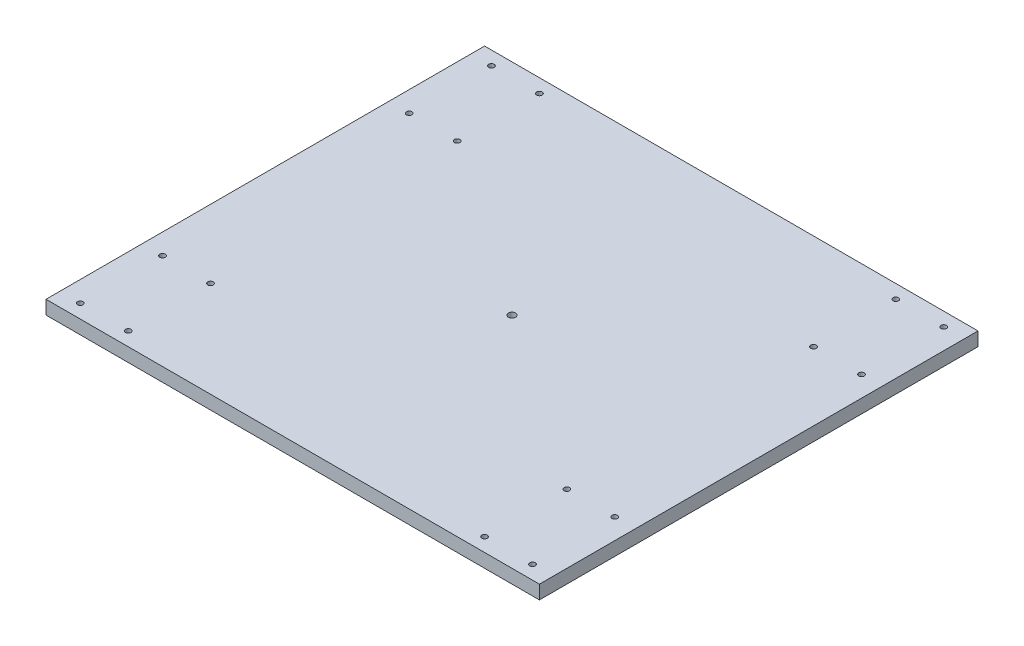
ISO-10303-21;
HEADER;
FILE_DESCRIPTION(('STEP AP214'),'2;1');
FILE_NAME('part.step','',(''),(''),'','','');
FILE_SCHEMA(('AUTOMOTIVE_DESIGN { 1 0 10303 214 1 1 1 1 }'));
ENDSEC;
DATA;
#1=APPLICATION_CONTEXT('core data for automotive mechanical design processes');
#2=APPLICATION_PROTOCOL_DEFINITION('international standard','automotive_design',2000,#1);
#3=PRODUCT_CONTEXT('',#1,'mechanical');
#4=PRODUCT('Part','Part','',(#3));
#5=PRODUCT_RELATED_PRODUCT_CATEGORY('part','',(#4));
#6=PRODUCT_DEFINITION_FORMATION('','',#4);
#7=PRODUCT_DEFINITION_CONTEXT('part definition',#1,'design');
#8=PRODUCT_DEFINITION('design','',#6,#7);
#9=PRODUCT_DEFINITION_SHAPE('','',#8);
#10=(LENGTH_UNIT() NAMED_UNIT(*) SI_UNIT(.MILLI.,.METRE.));
#11=(NAMED_UNIT(*) PLANE_ANGLE_UNIT() SI_UNIT($,.RADIAN.));
#12=(NAMED_UNIT(*) SI_UNIT($,.STERADIAN.) SOLID_ANGLE_UNIT());
#13=UNCERTAINTY_MEASURE_WITH_UNIT(LENGTH_MEASURE(1.E-05),#10,'distance_accuracy_value','');
#14=(GEOMETRIC_REPRESENTATION_CONTEXT(3) GLOBAL_UNCERTAINTY_ASSIGNED_CONTEXT((#13)) GLOBAL_UNIT_ASSIGNED_CONTEXT((#10,
#11,#12)) REPRESENTATION_CONTEXT('',''));
#15=CARTESIAN_POINT('',(0.,0.,0.));
#16=DIRECTION('',(0.,0.,1.));
#17=DIRECTION('',(1.,0.,0.));
#18=AXIS2_PLACEMENT_3D('',#15,#16,#17);
#19=CARTESIAN_POINT('',(0.,12.7,0.));
#20=DIRECTION('',(0.,-1.,0.));
#21=DIRECTION('',(0.,0.,-1.));
#22=AXIS2_PLACEMENT_3D('',#19,#20,#21);
#23=PLANE('',#22);
#24=CARTESIAN_POINT('',(0.,12.7,0.));
#25=DIRECTION('',(0.,1.,0.));
#26=DIRECTION('',(0.,0.,1.));
#27=AXIS2_PLACEMENT_3D('',#24,#25,#26);
#28=CIRCLE('',#27,3.37819999999999);
#29=CARTESIAN_POINT('',(0.,12.7,3.37819999999999));
#30=VERTEX_POINT('',#29);
#31=EDGE_CURVE('E458',#30,#30,#28,.T.);
#32=ORIENTED_EDGE('',*,*,#31,.F.);
#33=EDGE_LOOP('',(#32));
#34=FACE_BOUND('',#33,.T.);
#35=CARTESIAN_POINT('',(-209.55,12.7,-114.3));
#36=DIRECTION('',(0.,1.,0.));
#37=DIRECTION('',(0.,0.,1.));
#38=AXIS2_PLACEMENT_3D('',#35,#36,#37);
#39=CIRCLE('',#38,2.55269999999999);
#40=CARTESIAN_POINT('',(-209.55,12.7,-111.7473));
#41=VERTEX_POINT('',#40);
#42=EDGE_CURVE('E189',#41,#41,#39,.T.);
#43=ORIENTED_EDGE('',*,*,#42,.F.);
#44=EDGE_LOOP('',(#43));
#45=FACE_BOUND('',#44,.T.);
#46=CARTESIAN_POINT('',(165.1,12.7,-114.3));
#47=DIRECTION('',(0.,1.,0.));
#48=DIRECTION('',(0.,0.,1.));
#49=AXIS2_PLACEMENT_3D('',#46,#47,#48);
#50=CIRCLE('',#49,2.55269999999999);
#51=CARTESIAN_POINT('',(165.1,12.7,-111.7473));
#52=VERTEX_POINT('',#51);
#53=EDGE_CURVE('E161',#52,#52,#50,.T.);
#54=ORIENTED_EDGE('',*,*,#53,.F.);
#55=EDGE_LOOP('',(#54));
#56=FACE_BOUND('',#55,.T.);
#57=CARTESIAN_POINT('',(165.1,12.7,-190.5));
#58=DIRECTION('',(0.,1.,0.));
#59=DIRECTION('',(0.,0.,1.));
#60=AXIS2_PLACEMENT_3D('',#57,#58,#59);
#61=CIRCLE('',#60,2.55269999999999);
#62=CARTESIAN_POINT('',(165.1,12.7,-187.9473));
#63=VERTEX_POINT('',#62);
#64=EDGE_CURVE('E156',#63,#63,#61,.T.);
#65=ORIENTED_EDGE('',*,*,#64,.F.);
#66=EDGE_LOOP('',(#65));
#67=FACE_BOUND('',#66,.T.);
#68=CARTESIAN_POINT('',(209.55,12.7,190.5));
#69=DIRECTION('',(0.,1.,0.));
#70=DIRECTION('',(0.,0.,1.));
#71=AXIS2_PLACEMENT_3D('',#68,#69,#70);
#72=CIRCLE('',#71,2.55269999999999);
#73=CARTESIAN_POINT('',(209.55,12.7,193.0527));
#74=VERTEX_POINT('',#73);
#75=EDGE_CURVE('E151',#74,#74,#72,.T.);
#76=ORIENTED_EDGE('',*,*,#75,.F.);
#77=EDGE_LOOP('',(#76));
#78=FACE_BOUND('',#77,.T.);
#79=CARTESIAN_POINT('',(209.55,12.7,114.3));
#80=DIRECTION('',(0.,1.,0.));
#81=DIRECTION('',(0.,0.,1.));
#82=AXIS2_PLACEMENT_3D('',#79,#80,#81);
#83=CIRCLE('',#82,2.55269999999999);
#84=CARTESIAN_POINT('',(209.55,12.7,116.8527));
#85=VERTEX_POINT('',#84);
#86=EDGE_CURVE('E150',#85,#85,#83,.T.);
#87=ORIENTED_EDGE('',*,*,#86,.F.);
#88=EDGE_LOOP('',(#87));
#89=FACE_BOUND('',#88,.T.);
#90=CARTESIAN_POINT('',(165.1,12.7,114.3));
#91=DIRECTION('',(0.,1.,0.));
#92=DIRECTION('',(0.,0.,1.));
#93=AXIS2_PLACEMENT_3D('',#90,#91,#92);
#94=CIRCLE('',#93,2.55269999999999);
#95=CARTESIAN_POINT('',(165.1,12.7,116.8527));
#96=VERTEX_POINT('',#95);
#97=EDGE_CURVE('E219',#96,#96,#94,.T.);
#98=ORIENTED_EDGE('',*,*,#97,.F.);
#99=EDGE_LOOP('',(#98));
#100=FACE_BOUND('',#99,.T.);
#101=CARTESIAN_POINT('',(165.1,12.7,190.5));
#102=DIRECTION('',(0.,1.,0.));
#103=DIRECTION('',(0.,0.,1.));
#104=AXIS2_PLACEMENT_3D('',#101,#102,#103);
#105=CIRCLE('',#104,2.55269999999999);
#106=CARTESIAN_POINT('',(165.1,12.7,193.0527));
#107=VERTEX_POINT('',#106);
#108=EDGE_CURVE('E145',#107,#107,#105,.T.);
#109=ORIENTED_EDGE('',*,*,#108,.F.);
#110=EDGE_LOOP('',(#109));
#111=FACE_BOUND('',#110,.T.);
#112=CARTESIAN_POINT('',(-209.55,12.7,190.5));
#113=DIRECTION('',(0.,1.,0.));
#114=DIRECTION('',(0.,0.,1.));
#115=AXIS2_PLACEMENT_3D('',#112,#113,#114);
#116=CIRCLE('',#115,2.55269999999999);
#117=CARTESIAN_POINT('',(-209.55,12.7,193.0527));
#118=VERTEX_POINT('',#117);
#119=EDGE_CURVE('E140',#118,#118,#116,.T.);
#120=ORIENTED_EDGE('',*,*,#119,.F.);
#121=EDGE_LOOP('',(#120));
#122=FACE_BOUND('',#121,.T.);
#123=CARTESIAN_POINT('',(-165.1,12.7,114.3));
#124=DIRECTION('',(0.,1.,0.));
#125=DIRECTION('',(0.,0.,1.));
#126=AXIS2_PLACEMENT_3D('',#123,#124,#125);
#127=CIRCLE('',#126,2.55269999999999);
#128=CARTESIAN_POINT('',(-165.1,12.7,116.8527));
#129=VERTEX_POINT('',#128);
#130=EDGE_CURVE('E134',#129,#129,#127,.T.);
#131=ORIENTED_EDGE('',*,*,#130,.F.);
#132=EDGE_LOOP('',(#131));
#133=FACE_BOUND('',#132,.T.);
#134=CARTESIAN_POINT('',(-165.1,12.7,190.5));
#135=DIRECTION('',(0.,1.,0.));
#136=DIRECTION('',(0.,0.,1.));
#137=AXIS2_PLACEMENT_3D('',#134,#135,#136);
#138=CIRCLE('',#137,2.55269999999999);
#139=CARTESIAN_POINT('',(-165.1,12.7,193.0527));
#140=VERTEX_POINT('',#139);
#141=EDGE_CURVE('E133',#140,#140,#138,.T.);
#142=ORIENTED_EDGE('',*,*,#141,.F.);
#143=EDGE_LOOP('',(#142));
#144=FACE_BOUND('',#143,.T.);
#145=DIRECTION('',(0.,0.,-1.));
#146=VECTOR('',#145,1.);
#147=CARTESIAN_POINT('',(-228.6,12.7,203.2));
#148=LINE('',#147,#146);
#149=CARTESIAN_POINT('',(-228.6,12.7,203.2));
#150=VERTEX_POINT('',#149);
#151=CARTESIAN_POINT('',(-228.6,12.7,-203.2));
#152=VERTEX_POINT('',#151);
#153=EDGE_CURVE('E105',#150,#152,#148,.T.);
#154=ORIENTED_EDGE('',*,*,#153,.F.);
#155=DIRECTION('',(1.,0.,0.));
#156=VECTOR('',#155,1.);
#157=CARTESIAN_POINT('',(-228.6,12.7,203.2));
#158=LINE('',#157,#156);
#159=CARTESIAN_POINT('',(228.6,12.7,203.2));
#160=VERTEX_POINT('',#159);
#161=EDGE_CURVE('E91',#150,#160,#158,.T.);
#162=ORIENTED_EDGE('',*,*,#161,.T.);
#163=DIRECTION('',(0.,0.,-1.));
#164=VECTOR('',#163,1.);
#165=CARTESIAN_POINT('',(228.6,12.7,203.2));
#166=LINE('',#165,#164);
#167=CARTESIAN_POINT('',(228.6,12.7,-203.2));
#168=VERTEX_POINT('',#167);
#169=EDGE_CURVE('E86',#160,#168,#166,.T.);
#170=ORIENTED_EDGE('',*,*,#169,.T.);
#171=DIRECTION('',(1.,0.,0.));
#172=VECTOR('',#171,1.);
#173=CARTESIAN_POINT('',(-228.6,12.7,-203.2));
#174=LINE('',#173,#172);
#175=EDGE_CURVE('E90',#152,#168,#174,.T.);
#176=ORIENTED_EDGE('',*,*,#175,.F.);
#177=EDGE_LOOP('',(#154,#162,#170,#176));
#178=FACE_BOUND('',#177,.T.);
#179=CARTESIAN_POINT('',(-209.55,12.7,114.3));
#180=DIRECTION('',(0.,1.,0.));
#181=DIRECTION('',(0.,0.,1.));
#182=AXIS2_PLACEMENT_3D('',#179,#180,#181);
#183=CIRCLE('',#182,2.55269999999999);
#184=CARTESIAN_POINT('',(-209.55,12.7,116.8527));
#185=VERTEX_POINT('',#184);
#186=EDGE_CURVE('E139',#185,#185,#183,.T.);
#187=ORIENTED_EDGE('',*,*,#186,.F.);
#188=EDGE_LOOP('',(#187));
#189=FACE_BOUND('',#188,.T.);
#190=CARTESIAN_POINT('',(209.55,12.7,-114.3));
#191=DIRECTION('',(0.,1.,0.));
#192=DIRECTION('',(0.,0.,1.));
#193=AXIS2_PLACEMENT_3D('',#190,#191,#192);
#194=CIRCLE('',#193,2.55269999999999);
#195=CARTESIAN_POINT('',(209.55,12.7,-111.7473));
#196=VERTEX_POINT('',#195);
#197=EDGE_CURVE('E166',#196,#196,#194,.T.);
#198=ORIENTED_EDGE('',*,*,#197,.F.);
#199=EDGE_LOOP('',(#198));
#200=FACE_BOUND('',#199,.T.);
#201=CARTESIAN_POINT('',(209.55,12.7,-190.5));
#202=DIRECTION('',(0.,1.,0.));
#203=DIRECTION('',(0.,0.,1.));
#204=AXIS2_PLACEMENT_3D('',#201,#202,#203);
#205=CIRCLE('',#204,2.55269999999999);
#206=CARTESIAN_POINT('',(209.55,12.7,-187.9473));
#207=VERTEX_POINT('',#206);
#208=EDGE_CURVE('E170',#207,#207,#205,.T.);
#209=ORIENTED_EDGE('',*,*,#208,.F.);
#210=EDGE_LOOP('',(#209));
#211=FACE_BOUND('',#210,.T.);
#212=CARTESIAN_POINT('',(-165.1,12.7,-190.5));
#213=DIRECTION('',(0.,1.,0.));
#214=DIRECTION('',(0.,0.,1.));
#215=AXIS2_PLACEMENT_3D('',#212,#213,#214);
#216=CIRCLE('',#215,2.55269999999999);
#217=CARTESIAN_POINT('',(-165.1,12.7,-187.9473));
#218=VERTEX_POINT('',#217);
#219=EDGE_CURVE('E171',#218,#218,#216,.T.);
#220=ORIENTED_EDGE('',*,*,#219,.F.);
#221=EDGE_LOOP('',(#220));
#222=FACE_BOUND('',#221,.T.);
#223=CARTESIAN_POINT('',(-165.1,12.7,-114.3));
#224=DIRECTION('',(0.,1.,0.));
#225=DIRECTION('',(0.,0.,1.));
#226=AXIS2_PLACEMENT_3D('',#223,#224,#225);
#227=CIRCLE('',#226,2.55269999999999);
#228=CARTESIAN_POINT('',(-165.1,12.7,-111.7473));
#229=VERTEX_POINT('',#228);
#230=EDGE_CURVE('E175',#229,#229,#227,.T.);
#231=ORIENTED_EDGE('',*,*,#230,.F.);
#232=EDGE_LOOP('',(#231));
#233=FACE_BOUND('',#232,.T.);
#234=CARTESIAN_POINT('',(-209.55,12.7,-190.5));
#235=DIRECTION('',(0.,1.,0.));
#236=DIRECTION('',(0.,0.,1.));
#237=AXIS2_PLACEMENT_3D('',#234,#235,#236);
#238=CIRCLE('',#237,2.55269999999999);
#239=CARTESIAN_POINT('',(-209.55,12.7,-187.9473));
#240=VERTEX_POINT('',#239);
#241=EDGE_CURVE('E463',#240,#240,#238,.T.);
#242=ORIENTED_EDGE('',*,*,#241,.F.);
#243=EDGE_LOOP('',(#242));
#244=FACE_BOUND('',#243,.T.);
#245=ADVANCED_FACE('F38',(#34,#45,#56,#67,#78,#89,#100,#111,#122,#133,#144,#178,#189,#200,#211,
#222,#233,#244),#23,.F.);
#246=CARTESIAN_POINT('',(-228.6,12.7,203.2));
#247=DIRECTION('',(-1.,0.,0.));
#248=DIRECTION('',(0.,0.,1.));
#249=AXIS2_PLACEMENT_3D('',#246,#247,#248);
#250=PLANE('',#249);
#251=DIRECTION('',(0.,0.,-1.));
#252=VECTOR('',#251,1.);
#253=CARTESIAN_POINT('',(-228.6,0.,203.2));
#254=LINE('',#253,#252);
#255=CARTESIAN_POINT('',(-228.6,0.,203.2));
#256=VERTEX_POINT('',#255);
#257=CARTESIAN_POINT('',(-228.6,0.,-203.2));
#258=VERTEX_POINT('',#257);
#259=EDGE_CURVE('E113',#256,#258,#254,.T.);
#260=ORIENTED_EDGE('',*,*,#259,.F.);
#261=DIRECTION('',(0.,-1.,0.));
#262=VECTOR('',#261,1.);
#263=CARTESIAN_POINT('',(-228.6,12.7,203.2));
#264=LINE('',#263,#262);
#265=EDGE_CURVE('E11',#150,#256,#264,.T.);
#266=ORIENTED_EDGE('',*,*,#265,.F.);
#267=ORIENTED_EDGE('',*,*,#153,.T.);
#268=DIRECTION('',(0.,-1.,0.));
#269=VECTOR('',#268,1.);
#270=CARTESIAN_POINT('',(-228.6,12.7,-203.2));
#271=LINE('',#270,#269);
#272=EDGE_CURVE('E81',#152,#258,#271,.T.);
#273=ORIENTED_EDGE('',*,*,#272,.T.);
#274=EDGE_LOOP('',(#260,#266,#267,#273));
#275=FACE_BOUND('',#274,.T.);
#276=ADVANCED_FACE('F40',(#275),#250,.T.);
#277=CARTESIAN_POINT('',(-228.6,12.7,203.2));
#278=DIRECTION('',(0.,0.,-1.));
#279=DIRECTION('',(-1.,0.,0.));
#280=AXIS2_PLACEMENT_3D('',#277,#278,#279);
#281=PLANE('',#280);
#282=DIRECTION('',(1.,0.,0.));
#283=VECTOR('',#282,1.);
#284=CARTESIAN_POINT('',(-228.6,0.,203.2));
#285=LINE('',#284,#283);
#286=CARTESIAN_POINT('',(228.6,0.,203.2));
#287=VERTEX_POINT('',#286);
#288=EDGE_CURVE('E73',#256,#287,#285,.T.);
#289=ORIENTED_EDGE('',*,*,#288,.T.);
#290=DIRECTION('',(0.,-1.,0.));
#291=VECTOR('',#290,1.);
#292=CARTESIAN_POINT('',(228.6,12.7,203.2));
#293=LINE('',#292,#291);
#294=EDGE_CURVE('E49',#160,#287,#293,.T.);
#295=ORIENTED_EDGE('',*,*,#294,.F.);
#296=ORIENTED_EDGE('',*,*,#161,.F.);
#297=ORIENTED_EDGE('',*,*,#265,.T.);
#298=EDGE_LOOP('',(#289,#295,#296,#297));
#299=FACE_BOUND('',#298,.T.);
#300=ADVANCED_FACE('F258',(#299),#281,.F.);
#301=CARTESIAN_POINT('',(228.6,12.7,203.2));
#302=DIRECTION('',(-1.,0.,0.));
#303=DIRECTION('',(0.,0.,1.));
#304=AXIS2_PLACEMENT_3D('',#301,#302,#303);
#305=PLANE('',#304);
#306=DIRECTION('',(0.,0.,-1.));
#307=VECTOR('',#306,1.);
#308=CARTESIAN_POINT('',(228.6,0.,203.2));
#309=LINE('',#308,#307);
#310=CARTESIAN_POINT('',(228.6,0.,-203.2));
#311=VERTEX_POINT('',#310);
#312=EDGE_CURVE('E99',#287,#311,#309,.T.);
#313=ORIENTED_EDGE('',*,*,#312,.T.);
#314=DIRECTION('',(0.,-1.,0.));
#315=VECTOR('',#314,1.);
#316=CARTESIAN_POINT('',(228.6,12.7,-203.2));
#317=LINE('',#316,#315);
#318=EDGE_CURVE('E96',#168,#311,#317,.T.);
#319=ORIENTED_EDGE('',*,*,#318,.F.);
#320=ORIENTED_EDGE('',*,*,#169,.F.);
#321=ORIENTED_EDGE('',*,*,#294,.T.);
#322=EDGE_LOOP('',(#313,#319,#320,#321));
#323=FACE_BOUND('',#322,.T.);
#324=ADVANCED_FACE('F97',(#323),#305,.F.);
#325=CARTESIAN_POINT('',(-228.6,12.7,-203.2));
#326=DIRECTION('',(0.,0.,-1.));
#327=DIRECTION('',(-1.,0.,0.));
#328=AXIS2_PLACEMENT_3D('',#325,#326,#327);
#329=PLANE('',#328);
#330=DIRECTION('',(1.,0.,0.));
#331=VECTOR('',#330,1.);
#332=CARTESIAN_POINT('',(-228.6,0.,-203.2));
#333=LINE('',#332,#331);
#334=EDGE_CURVE('E117',#258,#311,#333,.T.);
#335=ORIENTED_EDGE('',*,*,#334,.F.);
#336=ORIENTED_EDGE('',*,*,#272,.F.);
#337=ORIENTED_EDGE('',*,*,#175,.T.);
#338=ORIENTED_EDGE('',*,*,#318,.T.);
#339=EDGE_LOOP('',(#335,#336,#337,#338));
#340=FACE_BOUND('',#339,.T.);
#341=ADVANCED_FACE('F103',(#340),#329,.T.);
#342=CARTESIAN_POINT('',(0.,0.,0.));
#343=DIRECTION('',(0.,-1.,0.));
#344=DIRECTION('',(0.,0.,-1.));
#345=AXIS2_PLACEMENT_3D('',#342,#343,#344);
#346=PLANE('',#345);
#347=CARTESIAN_POINT('',(0.,0.,0.));
#348=DIRECTION('',(0.,-1.,0.));
#349=DIRECTION('',(0.,0.,-1.));
#350=AXIS2_PLACEMENT_3D('',#347,#348,#349);
#351=CIRCLE('',#350,3.37819999999999);
#352=CARTESIAN_POINT('',(0.,0.,-3.37819999999999));
#353=VERTEX_POINT('',#352);
#354=EDGE_CURVE('E461',#353,#353,#351,.T.);
#355=ORIENTED_EDGE('',*,*,#354,.F.);
#356=EDGE_LOOP('',(#355));
#357=FACE_BOUND('',#356,.T.);
#358=CARTESIAN_POINT('',(-209.55,0.,-190.5));
#359=DIRECTION('',(0.,-1.,0.));
#360=DIRECTION('',(0.,0.,-1.));
#361=AXIS2_PLACEMENT_3D('',#358,#359,#360);
#362=CIRCLE('',#361,2.55269999999999);
#363=CARTESIAN_POINT('',(-209.55,0.,-193.0527));
#364=VERTEX_POINT('',#363);
#365=EDGE_CURVE('E42',#364,#364,#362,.T.);
#366=ORIENTED_EDGE('',*,*,#365,.F.);
#367=EDGE_LOOP('',(#366));
#368=FACE_BOUND('',#367,.T.);
#369=CARTESIAN_POINT('',(-209.55,0.,-114.3));
#370=DIRECTION('',(0.,-1.,0.));
#371=DIRECTION('',(0.,0.,-1.));
#372=AXIS2_PLACEMENT_3D('',#369,#370,#371);
#373=CIRCLE('',#372,2.55269999999999);
#374=CARTESIAN_POINT('',(-209.55,0.,-116.8527));
#375=VERTEX_POINT('',#374);
#376=EDGE_CURVE('E183',#375,#375,#373,.T.);
#377=ORIENTED_EDGE('',*,*,#376,.F.);
#378=EDGE_LOOP('',(#377));
#379=FACE_BOUND('',#378,.T.);
#380=CARTESIAN_POINT('',(-165.1,0.,-114.3));
#381=DIRECTION('',(0.,-1.,0.));
#382=DIRECTION('',(0.,0.,-1.));
#383=AXIS2_PLACEMENT_3D('',#380,#381,#382);
#384=CIRCLE('',#383,2.55269999999999);
#385=CARTESIAN_POINT('',(-165.1,0.,-116.8527));
#386=VERTEX_POINT('',#385);
#387=EDGE_CURVE('E172',#386,#386,#384,.T.);
#388=ORIENTED_EDGE('',*,*,#387,.F.);
#389=EDGE_LOOP('',(#388));
#390=FACE_BOUND('',#389,.T.);
#391=CARTESIAN_POINT('',(-165.1,0.,-190.5));
#392=DIRECTION('',(0.,-1.,0.));
#393=DIRECTION('',(0.,0.,-1.));
#394=AXIS2_PLACEMENT_3D('',#391,#392,#393);
#395=CIRCLE('',#394,2.55269999999999);
#396=CARTESIAN_POINT('',(-165.1,0.,-193.0527));
#397=VERTEX_POINT('',#396);
#398=EDGE_CURVE('E167',#397,#397,#395,.T.);
#399=ORIENTED_EDGE('',*,*,#398,.F.);
#400=EDGE_LOOP('',(#399));
#401=FACE_BOUND('',#400,.T.);
#402=CARTESIAN_POINT('',(209.55,0.,-190.5));
#403=DIRECTION('',(0.,-1.,0.));
#404=DIRECTION('',(0.,0.,-1.));
#405=AXIS2_PLACEMENT_3D('',#402,#403,#404);
#406=CIRCLE('',#405,2.55269999999999);
#407=CARTESIAN_POINT('',(209.55,0.,-193.0527));
#408=VERTEX_POINT('',#407);
#409=EDGE_CURVE('E196',#408,#408,#406,.T.);
#410=ORIENTED_EDGE('',*,*,#409,.F.);
#411=EDGE_LOOP('',(#410));
#412=FACE_BOUND('',#411,.T.);
#413=CARTESIAN_POINT('',(209.55,0.,-114.3));
#414=DIRECTION('',(0.,-1.,0.));
#415=DIRECTION('',(0.,0.,-1.));
#416=AXIS2_PLACEMENT_3D('',#413,#414,#415);
#417=CIRCLE('',#416,2.55269999999999);
#418=CARTESIAN_POINT('',(209.55,0.,-116.8527));
#419=VERTEX_POINT('',#418);
#420=EDGE_CURVE('E162',#419,#419,#417,.T.);
#421=ORIENTED_EDGE('',*,*,#420,.F.);
#422=EDGE_LOOP('',(#421));
#423=FACE_BOUND('',#422,.T.);
#424=CARTESIAN_POINT('',(165.1,0.,-114.3));
#425=DIRECTION('',(0.,-1.,0.));
#426=DIRECTION('',(0.,0.,-1.));
#427=AXIS2_PLACEMENT_3D('',#424,#425,#426);
#428=CIRCLE('',#427,2.55269999999999);
#429=CARTESIAN_POINT('',(165.1,0.,-116.8527));
#430=VERTEX_POINT('',#429);
#431=EDGE_CURVE('E157',#430,#430,#428,.T.);
#432=ORIENTED_EDGE('',*,*,#431,.F.);
#433=EDGE_LOOP('',(#432));
#434=FACE_BOUND('',#433,.T.);
#435=CARTESIAN_POINT('',(165.1,0.,-190.5));
#436=DIRECTION('',(0.,-1.,0.));
#437=DIRECTION('',(0.,0.,-1.));
#438=AXIS2_PLACEMENT_3D('',#435,#436,#437);
#439=CIRCLE('',#438,2.55269999999999);
#440=CARTESIAN_POINT('',(165.1,0.,-193.0527));
#441=VERTEX_POINT('',#440);
#442=EDGE_CURVE('E152',#441,#441,#439,.T.);
#443=ORIENTED_EDGE('',*,*,#442,.F.);
#444=EDGE_LOOP('',(#443));
#445=FACE_BOUND('',#444,.T.);
#446=CARTESIAN_POINT('',(209.55,0.,190.5));
#447=DIRECTION('',(0.,-1.,0.));
#448=DIRECTION('',(0.,0.,-1.));
#449=AXIS2_PLACEMENT_3D('',#446,#447,#448);
#450=CIRCLE('',#449,2.55269999999999);
#451=CARTESIAN_POINT('',(209.55,0.,187.9473));
#452=VERTEX_POINT('',#451);
#453=EDGE_CURVE('E146',#452,#452,#450,.T.);
#454=ORIENTED_EDGE('',*,*,#453,.F.);
#455=EDGE_LOOP('',(#454));
#456=FACE_BOUND('',#455,.T.);
#457=CARTESIAN_POINT('',(209.55,0.,114.3));
#458=DIRECTION('',(0.,-1.,0.));
#459=DIRECTION('',(0.,0.,-1.));
#460=AXIS2_PLACEMENT_3D('',#457,#458,#459);
#461=CIRCLE('',#460,2.55269999999999);
#462=CARTESIAN_POINT('',(209.55,0.,111.7473));
#463=VERTEX_POINT('',#462);
#464=EDGE_CURVE('E215',#463,#463,#461,.T.);
#465=ORIENTED_EDGE('',*,*,#464,.F.);
#466=EDGE_LOOP('',(#465));
#467=FACE_BOUND('',#466,.T.);
#468=CARTESIAN_POINT('',(165.1,0.,114.3));
#469=DIRECTION('',(0.,-1.,0.));
#470=DIRECTION('',(0.,0.,-1.));
#471=AXIS2_PLACEMENT_3D('',#468,#469,#470);
#472=CIRCLE('',#471,2.55269999999999);
#473=CARTESIAN_POINT('',(165.1,0.,111.7473));
#474=VERTEX_POINT('',#473);
#475=EDGE_CURVE('E223',#474,#474,#472,.T.);
#476=ORIENTED_EDGE('',*,*,#475,.F.);
#477=EDGE_LOOP('',(#476));
#478=FACE_BOUND('',#477,.T.);
#479=CARTESIAN_POINT('',(165.1,0.,190.5));
#480=DIRECTION('',(0.,-1.,0.));
#481=DIRECTION('',(0.,0.,-1.));
#482=AXIS2_PLACEMENT_3D('',#479,#480,#481);
#483=CIRCLE('',#482,2.55269999999999);
#484=CARTESIAN_POINT('',(165.1,0.,187.9473));
#485=VERTEX_POINT('',#484);
#486=EDGE_CURVE('E141',#485,#485,#483,.T.);
#487=ORIENTED_EDGE('',*,*,#486,.F.);
#488=EDGE_LOOP('',(#487));
#489=FACE_BOUND('',#488,.T.);
#490=CARTESIAN_POINT('',(-209.55,0.,190.5));
#491=DIRECTION('',(0.,-1.,0.));
#492=DIRECTION('',(0.,0.,-1.));
#493=AXIS2_PLACEMENT_3D('',#490,#491,#492);
#494=CIRCLE('',#493,2.55269999999999);
#495=CARTESIAN_POINT('',(-209.55,0.,187.9473));
#496=VERTEX_POINT('',#495);
#497=EDGE_CURVE('E135',#496,#496,#494,.T.);
#498=ORIENTED_EDGE('',*,*,#497,.F.);
#499=EDGE_LOOP('',(#498));
#500=FACE_BOUND('',#499,.T.);
#501=CARTESIAN_POINT('',(-209.55,0.,114.3));
#502=DIRECTION('',(0.,-1.,0.));
#503=DIRECTION('',(0.,0.,-1.));
#504=AXIS2_PLACEMENT_3D('',#501,#502,#503);
#505=CIRCLE('',#504,2.55269999999999);
#506=CARTESIAN_POINT('',(-209.55,0.,111.7473));
#507=VERTEX_POINT('',#506);
#508=EDGE_CURVE('E236',#507,#507,#505,.T.);
#509=ORIENTED_EDGE('',*,*,#508,.F.);
#510=EDGE_LOOP('',(#509));
#511=FACE_BOUND('',#510,.T.);
#512=CARTESIAN_POINT('',(-165.1,0.,114.3));
#513=DIRECTION('',(0.,-1.,0.));
#514=DIRECTION('',(0.,0.,-1.));
#515=AXIS2_PLACEMENT_3D('',#512,#513,#514);
#516=CIRCLE('',#515,2.55269999999999);
#517=CARTESIAN_POINT('',(-165.1,0.,111.7473));
#518=VERTEX_POINT('',#517);
#519=EDGE_CURVE('E129',#518,#518,#516,.T.);
#520=ORIENTED_EDGE('',*,*,#519,.F.);
#521=EDGE_LOOP('',(#520));
#522=FACE_BOUND('',#521,.T.);
#523=CARTESIAN_POINT('',(-165.1,0.,190.5));
#524=DIRECTION('',(0.,-1.,0.));
#525=DIRECTION('',(0.,0.,-1.));
#526=AXIS2_PLACEMENT_3D('',#523,#524,#525);
#527=CIRCLE('',#526,2.55269999999999);
#528=CARTESIAN_POINT('',(-165.1,0.,187.9473));
#529=VERTEX_POINT('',#528);
#530=EDGE_CURVE('E118',#529,#529,#527,.T.);
#531=ORIENTED_EDGE('',*,*,#530,.F.);
#532=EDGE_LOOP('',(#531));
#533=FACE_BOUND('',#532,.T.);
#534=ORIENTED_EDGE('',*,*,#259,.T.);
#535=ORIENTED_EDGE('',*,*,#334,.T.);
#536=ORIENTED_EDGE('',*,*,#312,.F.);
#537=ORIENTED_EDGE('',*,*,#288,.F.);
#538=EDGE_LOOP('',(#534,#535,#536,#537));
#539=FACE_BOUND('',#538,.T.);
#540=ADVANCED_FACE('F252',(#357,#368,#379,#390,#401,#412,#423,#434,#445,#456,#467,#478,#489,
#500,#511,#522,#533,#539),#346,.T.);
#541=CARTESIAN_POINT('',(-165.1,12.7,190.5));
#542=DIRECTION('',(0.,1.,0.));
#543=DIRECTION('',(0.,0.,1.));
#544=AXIS2_PLACEMENT_3D('',#541,#542,#543);
#545=CYLINDRICAL_SURFACE('',#544,2.55269999999999);
#546=ORIENTED_EDGE('',*,*,#530,.T.);
#547=EDGE_LOOP('',(#546));
#548=FACE_BOUND('',#547,.T.);
#549=ORIENTED_EDGE('',*,*,#141,.T.);
#550=EDGE_LOOP('',(#549));
#551=FACE_BOUND('',#550,.T.);
#552=ADVANCED_FACE('F249',(#548,#551),#545,.F.);
#553=CARTESIAN_POINT('',(-165.1,12.7,114.3));
#554=DIRECTION('',(0.,1.,0.));
#555=DIRECTION('',(0.,0.,1.));
#556=AXIS2_PLACEMENT_3D('',#553,#554,#555);
#557=CYLINDRICAL_SURFACE('',#556,2.55269999999999);
#558=ORIENTED_EDGE('',*,*,#519,.T.);
#559=EDGE_LOOP('',(#558));
#560=FACE_BOUND('',#559,.T.);
#561=ORIENTED_EDGE('',*,*,#130,.T.);
#562=EDGE_LOOP('',(#561));
#563=FACE_BOUND('',#562,.T.);
#564=ADVANCED_FACE('F294',(#560,#563),#557,.F.);
#565=CARTESIAN_POINT('',(-209.55,12.7,114.3));
#566=DIRECTION('',(0.,1.,0.));
#567=DIRECTION('',(0.,0.,1.));
#568=AXIS2_PLACEMENT_3D('',#565,#566,#567);
#569=CYLINDRICAL_SURFACE('',#568,2.55269999999999);
#570=ORIENTED_EDGE('',*,*,#508,.T.);
#571=EDGE_LOOP('',(#570));
#572=FACE_BOUND('',#571,.T.);
#573=ORIENTED_EDGE('',*,*,#186,.T.);
#574=EDGE_LOOP('',(#573));
#575=FACE_BOUND('',#574,.T.);
#576=ADVANCED_FACE('F299',(#572,#575),#569,.F.);
#577=CARTESIAN_POINT('',(-209.55,12.7,190.5));
#578=DIRECTION('',(0.,1.,0.));
#579=DIRECTION('',(0.,0.,1.));
#580=AXIS2_PLACEMENT_3D('',#577,#578,#579);
#581=CYLINDRICAL_SURFACE('',#580,2.55269999999999);
#582=ORIENTED_EDGE('',*,*,#497,.T.);
#583=EDGE_LOOP('',(#582));
#584=FACE_BOUND('',#583,.T.);
#585=ORIENTED_EDGE('',*,*,#119,.T.);
#586=EDGE_LOOP('',(#585));
#587=FACE_BOUND('',#586,.T.);
#588=ADVANCED_FACE('F306',(#584,#587),#581,.F.);
#589=CARTESIAN_POINT('',(165.1,12.7,190.5));
#590=DIRECTION('',(0.,1.,0.));
#591=DIRECTION('',(0.,0.,1.));
#592=AXIS2_PLACEMENT_3D('',#589,#590,#591);
#593=CYLINDRICAL_SURFACE('',#592,2.55269999999999);
#594=ORIENTED_EDGE('',*,*,#486,.T.);
#595=EDGE_LOOP('',(#594));
#596=FACE_BOUND('',#595,.T.);
#597=ORIENTED_EDGE('',*,*,#108,.T.);
#598=EDGE_LOOP('',(#597));
#599=FACE_BOUND('',#598,.T.);
#600=ADVANCED_FACE('F314',(#596,#599),#593,.F.);
#601=CARTESIAN_POINT('',(165.1,12.7,114.3));
#602=DIRECTION('',(0.,1.,0.));
#603=DIRECTION('',(0.,0.,1.));
#604=AXIS2_PLACEMENT_3D('',#601,#602,#603);
#605=CYLINDRICAL_SURFACE('',#604,2.55269999999999);
#606=ORIENTED_EDGE('',*,*,#475,.T.);
#607=EDGE_LOOP('',(#606));
#608=FACE_BOUND('',#607,.T.);
#609=ORIENTED_EDGE('',*,*,#97,.T.);
#610=EDGE_LOOP('',(#609));
#611=FACE_BOUND('',#610,.T.);
#612=ADVANCED_FACE('F322',(#608,#611),#605,.F.);
#613=CARTESIAN_POINT('',(209.55,12.7,114.3));
#614=DIRECTION('',(0.,1.,0.));
#615=DIRECTION('',(0.,0.,1.));
#616=AXIS2_PLACEMENT_3D('',#613,#614,#615);
#617=CYLINDRICAL_SURFACE('',#616,2.55269999999999);
#618=ORIENTED_EDGE('',*,*,#464,.T.);
#619=EDGE_LOOP('',(#618));
#620=FACE_BOUND('',#619,.T.);
#621=ORIENTED_EDGE('',*,*,#86,.T.);
#622=EDGE_LOOP('',(#621));
#623=FACE_BOUND('',#622,.T.);
#624=ADVANCED_FACE('F330',(#620,#623),#617,.F.);
#625=CARTESIAN_POINT('',(209.55,12.7,190.5));
#626=DIRECTION('',(0.,1.,0.));
#627=DIRECTION('',(0.,0.,1.));
#628=AXIS2_PLACEMENT_3D('',#625,#626,#627);
#629=CYLINDRICAL_SURFACE('',#628,2.55269999999999);
#630=ORIENTED_EDGE('',*,*,#453,.T.);
#631=EDGE_LOOP('',(#630));
#632=FACE_BOUND('',#631,.T.);
#633=ORIENTED_EDGE('',*,*,#75,.T.);
#634=EDGE_LOOP('',(#633));
#635=FACE_BOUND('',#634,.T.);
#636=ADVANCED_FACE('F338',(#632,#635),#629,.F.);
#637=CARTESIAN_POINT('',(165.1,12.7,-190.5));
#638=DIRECTION('',(0.,1.,0.));
#639=DIRECTION('',(0.,0.,1.));
#640=AXIS2_PLACEMENT_3D('',#637,#638,#639);
#641=CYLINDRICAL_SURFACE('',#640,2.55269999999999);
#642=ORIENTED_EDGE('',*,*,#442,.T.);
#643=EDGE_LOOP('',(#642));
#644=FACE_BOUND('',#643,.T.);
#645=ORIENTED_EDGE('',*,*,#64,.T.);
#646=EDGE_LOOP('',(#645));
#647=FACE_BOUND('',#646,.T.);
#648=ADVANCED_FACE('F346',(#644,#647),#641,.F.);
#649=CARTESIAN_POINT('',(165.1,12.7,-114.3));
#650=DIRECTION('',(0.,1.,0.));
#651=DIRECTION('',(0.,0.,1.));
#652=AXIS2_PLACEMENT_3D('',#649,#650,#651);
#653=CYLINDRICAL_SURFACE('',#652,2.55269999999999);
#654=ORIENTED_EDGE('',*,*,#431,.T.);
#655=EDGE_LOOP('',(#654));
#656=FACE_BOUND('',#655,.T.);
#657=ORIENTED_EDGE('',*,*,#53,.T.);
#658=EDGE_LOOP('',(#657));
#659=FACE_BOUND('',#658,.T.);
#660=ADVANCED_FACE('F354',(#656,#659),#653,.F.);
#661=CARTESIAN_POINT('',(209.55,12.7,-114.3));
#662=DIRECTION('',(0.,1.,0.));
#663=DIRECTION('',(0.,0.,1.));
#664=AXIS2_PLACEMENT_3D('',#661,#662,#663);
#665=CYLINDRICAL_SURFACE('',#664,2.55269999999999);
#666=ORIENTED_EDGE('',*,*,#420,.T.);
#667=EDGE_LOOP('',(#666));
#668=FACE_BOUND('',#667,.T.);
#669=ORIENTED_EDGE('',*,*,#197,.T.);
#670=EDGE_LOOP('',(#669));
#671=FACE_BOUND('',#670,.T.);
#672=ADVANCED_FACE('F362',(#668,#671),#665,.F.);
#673=CARTESIAN_POINT('',(209.55,12.7,-190.5));
#674=DIRECTION('',(0.,1.,0.));
#675=DIRECTION('',(0.,0.,1.));
#676=AXIS2_PLACEMENT_3D('',#673,#674,#675);
#677=CYLINDRICAL_SURFACE('',#676,2.55269999999999);
#678=ORIENTED_EDGE('',*,*,#409,.T.);
#679=EDGE_LOOP('',(#678));
#680=FACE_BOUND('',#679,.T.);
#681=ORIENTED_EDGE('',*,*,#208,.T.);
#682=EDGE_LOOP('',(#681));
#683=FACE_BOUND('',#682,.T.);
#684=ADVANCED_FACE('F370',(#680,#683),#677,.F.);
#685=CARTESIAN_POINT('',(-165.1,12.7,-190.5));
#686=DIRECTION('',(0.,1.,0.));
#687=DIRECTION('',(0.,0.,1.));
#688=AXIS2_PLACEMENT_3D('',#685,#686,#687);
#689=CYLINDRICAL_SURFACE('',#688,2.55269999999999);
#690=ORIENTED_EDGE('',*,*,#398,.T.);
#691=EDGE_LOOP('',(#690));
#692=FACE_BOUND('',#691,.T.);
#693=ORIENTED_EDGE('',*,*,#219,.T.);
#694=EDGE_LOOP('',(#693));
#695=FACE_BOUND('',#694,.T.);
#696=ADVANCED_FACE('F378',(#692,#695),#689,.F.);
#697=CARTESIAN_POINT('',(-165.1,12.7,-114.3));
#698=DIRECTION('',(0.,1.,0.));
#699=DIRECTION('',(0.,0.,1.));
#700=AXIS2_PLACEMENT_3D('',#697,#698,#699);
#701=CYLINDRICAL_SURFACE('',#700,2.55269999999999);
#702=ORIENTED_EDGE('',*,*,#387,.T.);
#703=EDGE_LOOP('',(#702));
#704=FACE_BOUND('',#703,.T.);
#705=ORIENTED_EDGE('',*,*,#230,.T.);
#706=EDGE_LOOP('',(#705));
#707=FACE_BOUND('',#706,.T.);
#708=ADVANCED_FACE('F386',(#704,#707),#701,.F.);
#709=CARTESIAN_POINT('',(-209.55,12.7,-114.3));
#710=DIRECTION('',(0.,1.,0.));
#711=DIRECTION('',(0.,0.,1.));
#712=AXIS2_PLACEMENT_3D('',#709,#710,#711);
#713=CYLINDRICAL_SURFACE('',#712,2.55269999999999);
#714=ORIENTED_EDGE('',*,*,#376,.T.);
#715=EDGE_LOOP('',(#714));
#716=FACE_BOUND('',#715,.T.);
#717=ORIENTED_EDGE('',*,*,#42,.T.);
#718=EDGE_LOOP('',(#717));
#719=FACE_BOUND('',#718,.T.);
#720=ADVANCED_FACE('F394',(#716,#719),#713,.F.);
#721=CARTESIAN_POINT('',(-209.55,12.7,-190.5));
#722=DIRECTION('',(0.,1.,0.));
#723=DIRECTION('',(0.,0.,1.));
#724=AXIS2_PLACEMENT_3D('',#721,#722,#723);
#725=CYLINDRICAL_SURFACE('',#724,2.55269999999999);
#726=ORIENTED_EDGE('',*,*,#365,.T.);
#727=EDGE_LOOP('',(#726));
#728=FACE_BOUND('',#727,.T.);
#729=ORIENTED_EDGE('',*,*,#241,.T.);
#730=EDGE_LOOP('',(#729));
#731=FACE_BOUND('',#730,.T.);
#732=ADVANCED_FACE('F401',(#728,#731),#725,.F.);
#733=CARTESIAN_POINT('',(0.,12.7,0.));
#734=DIRECTION('',(0.,1.,0.));
#735=DIRECTION('',(0.,0.,1.));
#736=AXIS2_PLACEMENT_3D('',#733,#734,#735);
#737=CYLINDRICAL_SURFACE('',#736,3.37819999999999);
#738=ORIENTED_EDGE('',*,*,#31,.T.);
#739=EDGE_LOOP('',(#738));
#740=FACE_BOUND('',#739,.T.);
#741=ORIENTED_EDGE('',*,*,#354,.T.);
#742=EDGE_LOOP('',(#741));
#743=FACE_BOUND('',#742,.T.);
#744=ADVANCED_FACE('F408',(#740,#743),#737,.F.);
#745=CLOSED_SHELL('',(#245,#276,#300,#324,#341,#540,#552,#564,#576,#588,#600,#612,#624,#636,
#648,#660,#672,#684,#696,#708,#720,#732,#744));
#746=MANIFOLD_SOLID_BREP('B2',#745);
#747=ADVANCED_BREP_SHAPE_REPRESENTATION('',(#18,#746),#14);
#748=SHAPE_DEFINITION_REPRESENTATION(#9,#747);
ENDSEC;
END-ISO-10303-21;
